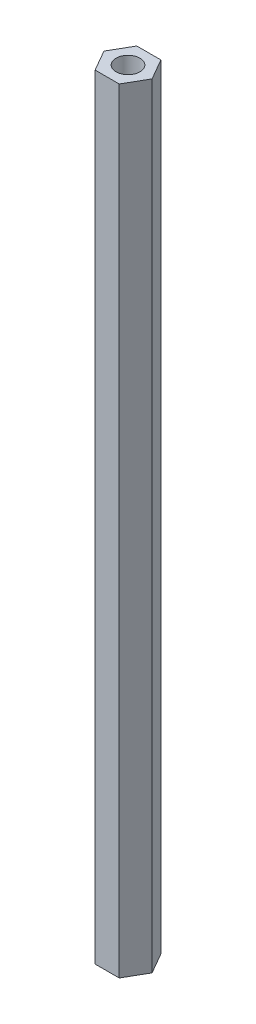
ISO-10303-21;
HEADER;
FILE_DESCRIPTION(('STEP AP214'),'2;1');
FILE_NAME('part.step','',(''),(''),'','','');
FILE_SCHEMA(('AUTOMOTIVE_DESIGN { 1 0 10303 214 1 1 1 1 }'));
ENDSEC;
DATA;
#1=APPLICATION_CONTEXT('core data for automotive mechanical design processes');
#2=APPLICATION_PROTOCOL_DEFINITION('international standard','automotive_design',2000,#1);
#3=PRODUCT_CONTEXT('',#1,'mechanical');
#4=PRODUCT('Part','Part','',(#3));
#5=PRODUCT_RELATED_PRODUCT_CATEGORY('part','',(#4));
#6=PRODUCT_DEFINITION_FORMATION('','',#4);
#7=PRODUCT_DEFINITION_CONTEXT('part definition',#1,'design');
#8=PRODUCT_DEFINITION('design','',#6,#7);
#9=PRODUCT_DEFINITION_SHAPE('','',#8);
#10=(LENGTH_UNIT() NAMED_UNIT(*) SI_UNIT(.MILLI.,.METRE.));
#11=(NAMED_UNIT(*) PLANE_ANGLE_UNIT() SI_UNIT($,.RADIAN.));
#12=(NAMED_UNIT(*) SI_UNIT($,.STERADIAN.) SOLID_ANGLE_UNIT());
#13=UNCERTAINTY_MEASURE_WITH_UNIT(LENGTH_MEASURE(1.E-05),#10,'distance_accuracy_value','');
#14=(GEOMETRIC_REPRESENTATION_CONTEXT(3) GLOBAL_UNCERTAINTY_ASSIGNED_CONTEXT((#13)) GLOBAL_UNIT_ASSIGNED_CONTEXT((#10,
#11,#12)) REPRESENTATION_CONTEXT('',''));
#15=CARTESIAN_POINT('',(0.,0.,0.));
#16=DIRECTION('',(0.,0.,1.));
#17=DIRECTION('',(1.,0.,0.));
#18=AXIS2_PLACEMENT_3D('',#15,#16,#17);
#19=CARTESIAN_POINT('',(0.,130.,0.));
#20=DIRECTION('',(0.,1.,0.));
#21=DIRECTION('',(0.,0.,1.));
#22=AXIS2_PLACEMENT_3D('',#19,#20,#21);
#23=PLANE('',#22);
#24=DIRECTION('',(0.499999999999999,0.,-0.866025403784439));
#25=VECTOR('',#24,1.);
#26=CARTESIAN_POINT('',(2.02072594216369,130.,3.5));
#27=LINE('',#26,#25);
#28=CARTESIAN_POINT('',(2.02072594216369,130.,3.5));
#29=VERTEX_POINT('',#28);
#30=CARTESIAN_POINT('',(4.04145188432738,130.,0.));
#31=VERTEX_POINT('',#30);
#32=EDGE_CURVE('E152',#29,#31,#27,.T.);
#33=ORIENTED_EDGE('',*,*,#32,.T.);
#34=DIRECTION('',(-0.5,0.,-0.866025403784438));
#35=VECTOR('',#34,1.);
#36=CARTESIAN_POINT('',(4.04145188432738,130.,0.));
#37=LINE('',#36,#35);
#38=CARTESIAN_POINT('',(2.02072594216369,130.,-3.5));
#39=VERTEX_POINT('',#38);
#40=EDGE_CURVE('E100',#31,#39,#37,.T.);
#41=ORIENTED_EDGE('',*,*,#40,.T.);
#42=DIRECTION('',(-1.,0.,0.));
#43=VECTOR('',#42,1.);
#44=CARTESIAN_POINT('',(2.02072594216369,130.,-3.5));
#45=LINE('',#44,#43);
#46=CARTESIAN_POINT('',(-2.02072594216369,130.,-3.5));
#47=VERTEX_POINT('',#46);
#48=EDGE_CURVE('E113',#39,#47,#45,.T.);
#49=ORIENTED_EDGE('',*,*,#48,.T.);
#50=DIRECTION('',(-0.5,0.,0.866025403784439));
#51=VECTOR('',#50,1.);
#52=CARTESIAN_POINT('',(-2.02072594216369,130.,-3.5));
#53=LINE('',#52,#51);
#54=CARTESIAN_POINT('',(-4.04145188432738,130.,0.));
#55=VERTEX_POINT('',#54);
#56=EDGE_CURVE('E107',#47,#55,#53,.T.);
#57=ORIENTED_EDGE('',*,*,#56,.T.);
#58=DIRECTION('',(0.5,0.,0.866025403784439));
#59=VECTOR('',#58,1.);
#60=CARTESIAN_POINT('',(-4.04145188432738,130.,0.));
#61=LINE('',#60,#59);
#62=CARTESIAN_POINT('',(-2.02072594216369,130.,3.5));
#63=VERTEX_POINT('',#62);
#64=EDGE_CURVE('E111',#55,#63,#61,.T.);
#65=ORIENTED_EDGE('',*,*,#64,.T.);
#66=DIRECTION('',(1.,0.,0.));
#67=VECTOR('',#66,1.);
#68=CARTESIAN_POINT('',(-2.02072594216369,130.,3.5));
#69=LINE('',#68,#67);
#70=EDGE_CURVE('E63',#63,#29,#69,.T.);
#71=ORIENTED_EDGE('',*,*,#70,.T.);
#72=EDGE_LOOP('',(#33,#41,#49,#57,#65,#71));
#73=FACE_BOUND('',#72,.T.);
#74=CARTESIAN_POINT('',(0.,130.,0.));
#75=DIRECTION('',(0.,1.,0.));
#76=DIRECTION('',(0.,0.,1.));
#77=AXIS2_PLACEMENT_3D('',#74,#75,#76);
#78=CIRCLE('',#77,2.);
#79=CARTESIAN_POINT('',(0.,130.,2.));
#80=VERTEX_POINT('',#79);
#81=EDGE_CURVE('E140',#80,#80,#78,.T.);
#82=ORIENTED_EDGE('',*,*,#81,.F.);
#83=EDGE_LOOP('',(#82));
#84=FACE_BOUND('',#83,.T.);
#85=ADVANCED_FACE('F45',(#73,#84),#23,.T.);
#86=CARTESIAN_POINT('',(0.,0.,0.));
#87=DIRECTION('',(0.,1.,0.));
#88=DIRECTION('',(0.,0.,1.));
#89=AXIS2_PLACEMENT_3D('',#86,#87,#88);
#90=PLANE('',#89);
#91=DIRECTION('',(0.499999999999999,0.,-0.866025403784439));
#92=VECTOR('',#91,1.);
#93=CARTESIAN_POINT('',(2.02072594216369,0.,3.5));
#94=LINE('',#93,#92);
#95=CARTESIAN_POINT('',(2.02072594216369,0.,3.5));
#96=VERTEX_POINT('',#95);
#97=CARTESIAN_POINT('',(4.04145188432738,0.,0.));
#98=VERTEX_POINT('',#97);
#99=EDGE_CURVE('E135',#96,#98,#94,.T.);
#100=ORIENTED_EDGE('',*,*,#99,.F.);
#101=DIRECTION('',(1.,0.,0.));
#102=VECTOR('',#101,1.);
#103=CARTESIAN_POINT('',(-2.02072594216369,0.,3.5));
#104=LINE('',#103,#102);
#105=CARTESIAN_POINT('',(-2.02072594216369,0.,3.5));
#106=VERTEX_POINT('',#105);
#107=EDGE_CURVE('E92',#106,#96,#104,.T.);
#108=ORIENTED_EDGE('',*,*,#107,.F.);
#109=DIRECTION('',(0.5,0.,0.866025403784439));
#110=VECTOR('',#109,1.);
#111=CARTESIAN_POINT('',(-4.04145188432738,0.,0.));
#112=LINE('',#111,#110);
#113=CARTESIAN_POINT('',(-4.04145188432738,0.,0.));
#114=VERTEX_POINT('',#113);
#115=EDGE_CURVE('E86',#114,#106,#112,.T.);
#116=ORIENTED_EDGE('',*,*,#115,.F.);
#117=DIRECTION('',(-0.5,0.,0.866025403784439));
#118=VECTOR('',#117,1.);
#119=CARTESIAN_POINT('',(-2.02072594216369,0.,-3.5));
#120=LINE('',#119,#118);
#121=CARTESIAN_POINT('',(-2.02072594216369,0.,-3.5));
#122=VERTEX_POINT('',#121);
#123=EDGE_CURVE('E122',#122,#114,#120,.T.);
#124=ORIENTED_EDGE('',*,*,#123,.F.);
#125=DIRECTION('',(-1.,0.,0.));
#126=VECTOR('',#125,1.);
#127=CARTESIAN_POINT('',(2.02072594216369,0.,-3.5));
#128=LINE('',#127,#126);
#129=CARTESIAN_POINT('',(2.02072594216369,0.,-3.5));
#130=VERTEX_POINT('',#129);
#131=EDGE_CURVE('E143',#130,#122,#128,.T.);
#132=ORIENTED_EDGE('',*,*,#131,.F.);
#133=DIRECTION('',(-0.5,0.,-0.866025403784438));
#134=VECTOR('',#133,1.);
#135=CARTESIAN_POINT('',(4.04145188432738,0.,0.));
#136=LINE('',#135,#134);
#137=EDGE_CURVE('E139',#98,#130,#136,.T.);
#138=ORIENTED_EDGE('',*,*,#137,.F.);
#139=EDGE_LOOP('',(#100,#108,#116,#124,#132,#138));
#140=FACE_BOUND('',#139,.T.);
#141=CARTESIAN_POINT('',(0.,0.,0.));
#142=DIRECTION('',(0.,1.,0.));
#143=DIRECTION('',(0.,0.,1.));
#144=AXIS2_PLACEMENT_3D('',#141,#142,#143);
#145=CIRCLE('',#144,2.);
#146=CARTESIAN_POINT('',(0.,0.,2.));
#147=VERTEX_POINT('',#146);
#148=EDGE_CURVE('E249',#147,#147,#145,.T.);
#149=ORIENTED_EDGE('',*,*,#148,.T.);
#150=EDGE_LOOP('',(#149));
#151=FACE_BOUND('',#150,.T.);
#152=ADVANCED_FACE('F165',(#140,#151),#90,.F.);
#153=CARTESIAN_POINT('',(2.02072594216369,130.,3.5));
#154=DIRECTION('',(-0.866025403784439,0.,-0.499999999999999));
#155=DIRECTION('',(-0.499999999999999,0.,0.866025403784439));
#156=AXIS2_PLACEMENT_3D('',#153,#154,#155);
#157=PLANE('',#156);
#158=ORIENTED_EDGE('',*,*,#99,.T.);
#159=DIRECTION('',(0.,-1.,0.));
#160=VECTOR('',#159,1.);
#161=CARTESIAN_POINT('',(4.04145188432738,130.,0.));
#162=LINE('',#161,#160);
#163=EDGE_CURVE('E11',#31,#98,#162,.T.);
#164=ORIENTED_EDGE('',*,*,#163,.F.);
#165=ORIENTED_EDGE('',*,*,#32,.F.);
#166=DIRECTION('',(0.,-1.,0.));
#167=VECTOR('',#166,1.);
#168=CARTESIAN_POINT('',(2.02072594216369,130.,3.5));
#169=LINE('',#168,#167);
#170=EDGE_CURVE('E131',#29,#96,#169,.T.);
#171=ORIENTED_EDGE('',*,*,#170,.T.);
#172=EDGE_LOOP('',(#158,#164,#165,#171));
#173=FACE_BOUND('',#172,.T.);
#174=ADVANCED_FACE('F47',(#173),#157,.F.);
#175=CARTESIAN_POINT('',(4.04145188432738,130.,0.));
#176=DIRECTION('',(-0.866025403784438,0.,0.5));
#177=DIRECTION('',(0.5,0.,0.866025403784439));
#178=AXIS2_PLACEMENT_3D('',#175,#176,#177);
#179=PLANE('',#178);
#180=ORIENTED_EDGE('',*,*,#137,.T.);
#181=DIRECTION('',(0.,-1.,0.));
#182=VECTOR('',#181,1.);
#183=CARTESIAN_POINT('',(2.02072594216369,130.,-3.5));
#184=LINE('',#183,#182);
#185=EDGE_CURVE('E55',#39,#130,#184,.T.);
#186=ORIENTED_EDGE('',*,*,#185,.F.);
#187=ORIENTED_EDGE('',*,*,#40,.F.);
#188=ORIENTED_EDGE('',*,*,#163,.T.);
#189=EDGE_LOOP('',(#180,#186,#187,#188));
#190=FACE_BOUND('',#189,.T.);
#191=ADVANCED_FACE('F190',(#190),#179,.F.);
#192=CARTESIAN_POINT('',(2.02072594216369,130.,-3.5));
#193=DIRECTION('',(0.,0.,1.));
#194=DIRECTION('',(1.,0.,0.));
#195=AXIS2_PLACEMENT_3D('',#192,#193,#194);
#196=PLANE('',#195);
#197=ORIENTED_EDGE('',*,*,#131,.T.);
#198=DIRECTION('',(0.,-1.,0.));
#199=VECTOR('',#198,1.);
#200=CARTESIAN_POINT('',(-2.02072594216369,130.,-3.5));
#201=LINE('',#200,#199);
#202=EDGE_CURVE('E124',#47,#122,#201,.T.);
#203=ORIENTED_EDGE('',*,*,#202,.F.);
#204=ORIENTED_EDGE('',*,*,#48,.F.);
#205=ORIENTED_EDGE('',*,*,#185,.T.);
#206=EDGE_LOOP('',(#197,#203,#204,#205));
#207=FACE_BOUND('',#206,.T.);
#208=ADVANCED_FACE('F162',(#207),#196,.F.);
#209=CARTESIAN_POINT('',(-2.02072594216369,130.,-3.5));
#210=DIRECTION('',(0.866025403784439,0.,0.5));
#211=DIRECTION('',(0.5,0.,-0.866025403784439));
#212=AXIS2_PLACEMENT_3D('',#209,#210,#211);
#213=PLANE('',#212);
#214=ORIENTED_EDGE('',*,*,#123,.T.);
#215=DIRECTION('',(0.,-1.,0.));
#216=VECTOR('',#215,1.);
#217=CARTESIAN_POINT('',(-4.04145188432738,130.,0.));
#218=LINE('',#217,#216);
#219=EDGE_CURVE('E119',#55,#114,#218,.T.);
#220=ORIENTED_EDGE('',*,*,#219,.F.);
#221=ORIENTED_EDGE('',*,*,#56,.F.);
#222=ORIENTED_EDGE('',*,*,#202,.T.);
#223=EDGE_LOOP('',(#214,#220,#221,#222));
#224=FACE_BOUND('',#223,.T.);
#225=ADVANCED_FACE('F120',(#224),#213,.F.);
#226=CARTESIAN_POINT('',(-4.04145188432738,130.,0.));
#227=DIRECTION('',(0.866025403784438,0.,-0.5));
#228=DIRECTION('',(-0.5,0.,-0.866025403784439));
#229=AXIS2_PLACEMENT_3D('',#226,#227,#228);
#230=PLANE('',#229);
#231=ORIENTED_EDGE('',*,*,#115,.T.);
#232=DIRECTION('',(0.,-1.,0.));
#233=VECTOR('',#232,1.);
#234=CARTESIAN_POINT('',(-2.02072594216369,130.,3.5));
#235=LINE('',#234,#233);
#236=EDGE_CURVE('E125',#63,#106,#235,.T.);
#237=ORIENTED_EDGE('',*,*,#236,.F.);
#238=ORIENTED_EDGE('',*,*,#64,.F.);
#239=ORIENTED_EDGE('',*,*,#219,.T.);
#240=EDGE_LOOP('',(#231,#237,#238,#239));
#241=FACE_BOUND('',#240,.T.);
#242=ADVANCED_FACE('F127',(#241),#230,.F.);
#243=CARTESIAN_POINT('',(-2.02072594216369,130.,3.5));
#244=DIRECTION('',(0.,0.,-1.));
#245=DIRECTION('',(-1.,0.,0.));
#246=AXIS2_PLACEMENT_3D('',#243,#244,#245);
#247=PLANE('',#246);
#248=ORIENTED_EDGE('',*,*,#107,.T.);
#249=ORIENTED_EDGE('',*,*,#170,.F.);
#250=ORIENTED_EDGE('',*,*,#70,.F.);
#251=ORIENTED_EDGE('',*,*,#236,.T.);
#252=EDGE_LOOP('',(#248,#249,#250,#251));
#253=FACE_BOUND('',#252,.T.);
#254=ADVANCED_FACE('F170',(#253),#247,.F.);
#255=CARTESIAN_POINT('',(0.,130.,0.));
#256=DIRECTION('',(0.,-1.,0.));
#257=DIRECTION('',(0.,0.,-1.));
#258=AXIS2_PLACEMENT_3D('',#255,#256,#257);
#259=CYLINDRICAL_SURFACE('',#258,2.);
#260=ORIENTED_EDGE('',*,*,#81,.T.);
#261=EDGE_LOOP('',(#260));
#262=FACE_BOUND('',#261,.T.);
#263=ORIENTED_EDGE('',*,*,#148,.F.);
#264=EDGE_LOOP('',(#263));
#265=FACE_BOUND('',#264,.T.);
#266=ADVANCED_FACE('F172',(#262,#265),#259,.F.);
#267=CLOSED_SHELL('',(#85,#152,#174,#191,#208,#225,#242,#254,#266));
#268=MANIFOLD_SOLID_BREP('B2',#267);
#269=ADVANCED_BREP_SHAPE_REPRESENTATION('',(#18,#268),#14);
#270=SHAPE_DEFINITION_REPRESENTATION(#9,#269);
ENDSEC;
END-ISO-10303-21;
